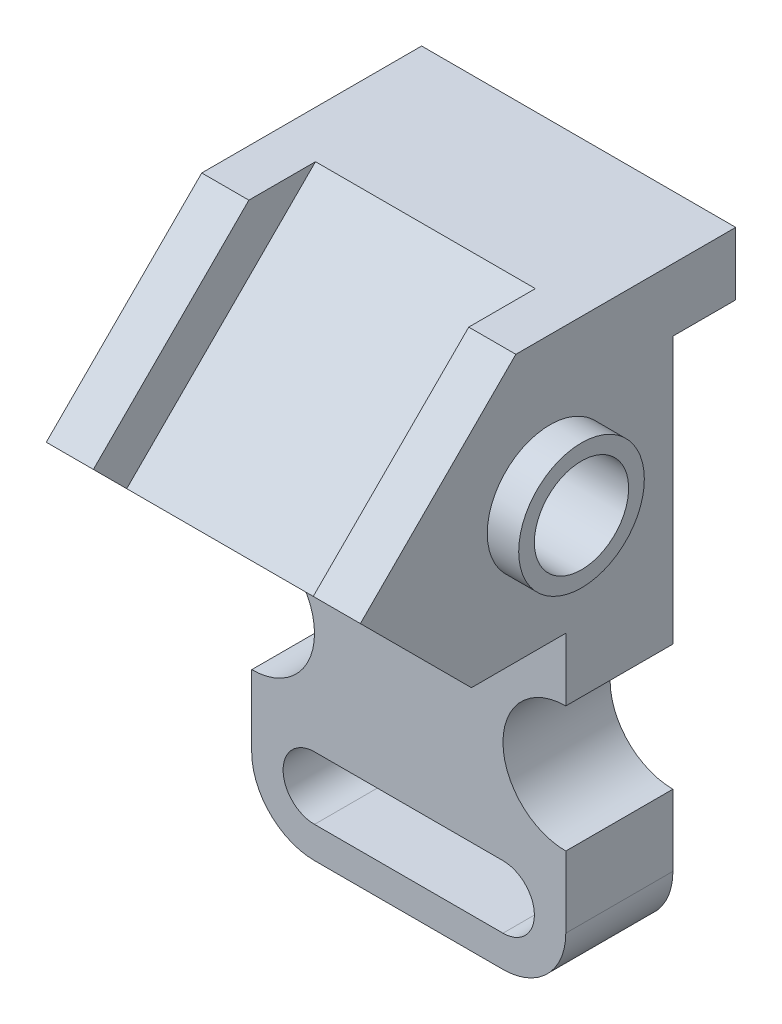
ISO-10303-21;
HEADER;
FILE_DESCRIPTION(('STEP AP214'),'2;1');
FILE_NAME('part.step','',(''),(''),'','','');
FILE_SCHEMA(('AUTOMOTIVE_DESIGN { 1 0 10303 214 1 1 1 1 }'));
ENDSEC;
DATA;
#1=APPLICATION_CONTEXT('core data for automotive mechanical design processes');
#2=APPLICATION_PROTOCOL_DEFINITION('international standard','automotive_design',2000,#1);
#3=PRODUCT_CONTEXT('',#1,'mechanical');
#4=PRODUCT('Part','Part','',(#3));
#5=PRODUCT_RELATED_PRODUCT_CATEGORY('part','',(#4));
#6=PRODUCT_DEFINITION_FORMATION('','',#4);
#7=PRODUCT_DEFINITION_CONTEXT('part definition',#1,'design');
#8=PRODUCT_DEFINITION('design','',#6,#7);
#9=PRODUCT_DEFINITION_SHAPE('','',#8);
#10=(LENGTH_UNIT() NAMED_UNIT(*) SI_UNIT(.MILLI.,.METRE.));
#11=(NAMED_UNIT(*) PLANE_ANGLE_UNIT() SI_UNIT($,.RADIAN.));
#12=(NAMED_UNIT(*) SI_UNIT($,.STERADIAN.) SOLID_ANGLE_UNIT());
#13=UNCERTAINTY_MEASURE_WITH_UNIT(LENGTH_MEASURE(1.E-05),#10,'distance_accuracy_value','');
#14=(GEOMETRIC_REPRESENTATION_CONTEXT(3) GLOBAL_UNCERTAINTY_ASSIGNED_CONTEXT((#13)) GLOBAL_UNIT_ASSIGNED_CONTEXT((#10,
#11,#12)) REPRESENTATION_CONTEXT('',''));
#15=CARTESIAN_POINT('',(0.,0.,0.));
#16=DIRECTION('',(0.,0.,1.));
#17=DIRECTION('',(1.,0.,0.));
#18=AXIS2_PLACEMENT_3D('',#15,#16,#17);
#19=CARTESIAN_POINT('',(0.,187.553608525557,34.1));
#20=DIRECTION('',(0.,-1.,0.));
#21=DIRECTION('',(0.,0.,-1.));
#22=AXIS2_PLACEMENT_3D('',#19,#20,#21);
#23=PLANE('',#22);
#24=DIRECTION('',(0.,0.,1.));
#25=VECTOR('',#24,1.);
#26=CARTESIAN_POINT('',(-35.,187.553608525557,34.1));
#27=LINE('',#26,#25);
#28=CARTESIAN_POINT('',(-35.,187.553608525557,28.7867965644037));
#29=VERTEX_POINT('',#28);
#30=CARTESIAN_POINT('',(-35.0000000000001,187.553608525557,50.));
#31=VERTEX_POINT('',#30);
#32=EDGE_CURVE('E54',#29,#31,#27,.T.);
#33=ORIENTED_EDGE('',*,*,#32,.F.);
#34=DIRECTION('',(1.,0.,0.));
#35=VECTOR('',#34,1.);
#36=CARTESIAN_POINT('',(0.,187.553608525557,28.7867965644037));
#37=LINE('',#36,#35);
#38=CARTESIAN_POINT('',(35.,187.553608525557,28.7867965644037));
#39=VERTEX_POINT('',#38);
#40=EDGE_CURVE('E271',#29,#39,#37,.T.);
#41=ORIENTED_EDGE('',*,*,#40,.T.);
#42=DIRECTION('',(0.,0.,1.));
#43=VECTOR('',#42,1.);
#44=CARTESIAN_POINT('',(35.,187.553608525557,34.1));
#45=LINE('',#44,#43);
#46=CARTESIAN_POINT('',(35.,187.553608525557,50.));
#47=VERTEX_POINT('',#46);
#48=EDGE_CURVE('E268',#39,#47,#45,.T.);
#49=ORIENTED_EDGE('',*,*,#48,.T.);
#50=DIRECTION('',(1.,0.,0.));
#51=VECTOR('',#50,1.);
#52=CARTESIAN_POINT('',(-107.129966372259,187.553608525557,50.));
#53=LINE('',#52,#51);
#54=CARTESIAN_POINT('',(50.,187.553608525557,50.));
#55=VERTEX_POINT('',#54);
#56=EDGE_CURVE('E283',#47,#55,#53,.T.);
#57=ORIENTED_EDGE('',*,*,#56,.T.);
#58=DIRECTION('',(0.,0.,-1.));
#59=VECTOR('',#58,1.);
#60=CARTESIAN_POINT('',(50.,187.553608525557,34.1));
#61=LINE('',#60,#59);
#62=CARTESIAN_POINT('',(50.,187.553608525557,-20.));
#63=VERTEX_POINT('',#62);
#64=EDGE_CURVE('E301',#55,#63,#61,.T.);
#65=ORIENTED_EDGE('',*,*,#64,.T.);
#66=DIRECTION('',(1.,0.,0.));
#67=VECTOR('',#66,1.);
#68=CARTESIAN_POINT('',(-28.2842712474619,187.553608525557,-20.));
#69=LINE('',#68,#67);
#70=CARTESIAN_POINT('',(-50.,187.553608525557,-20.));
#71=VERTEX_POINT('',#70);
#72=EDGE_CURVE('E298',#71,#63,#69,.T.);
#73=ORIENTED_EDGE('',*,*,#72,.F.);
#74=DIRECTION('',(0.,0.,-1.));
#75=VECTOR('',#74,1.);
#76=CARTESIAN_POINT('',(-50.,187.553608525557,34.1));
#77=LINE('',#76,#75);
#78=CARTESIAN_POINT('',(-50.,187.553608525557,50.));
#79=VERTEX_POINT('',#78);
#80=EDGE_CURVE('E228',#79,#71,#77,.T.);
#81=ORIENTED_EDGE('',*,*,#80,.F.);
#82=DIRECTION('',(-1.,0.,0.));
#83=VECTOR('',#82,1.);
#84=CARTESIAN_POINT('',(107.129966372259,187.553608525557,50.));
#85=LINE('',#84,#83);
#86=EDGE_CURVE('E217',#31,#79,#85,.T.);
#87=ORIENTED_EDGE('',*,*,#86,.F.);
#88=EDGE_LOOP('',(#33,#41,#49,#57,#65,#73,#81,#87));
#89=FACE_BOUND('',#88,.T.);
#90=ADVANCED_FACE('F39',(#89),#23,.F.);
#91=CARTESIAN_POINT('',(-107.129966372259,138.056133842498,99.4974746830582));
#92=DIRECTION('',(0.,-0.70710678118655,0.707106781186545));
#93=DIRECTION('',(0.,-0.707106781186545,-0.70710678118655));
#94=AXIS2_PLACEMENT_3D('',#91,#92,#93);
#95=PLANE('',#94);
#96=DIRECTION('',(1.,0.,0.));
#97=VECTOR('',#96,1.);
#98=CARTESIAN_POINT('',(35.,127.4495321247,88.8908729652599));
#99=LINE('',#98,#97);
#100=CARTESIAN_POINT('',(-35.,127.4495321247,88.8908729652599));
#101=VERTEX_POINT('',#100);
#102=CARTESIAN_POINT('',(35.,127.4495321247,88.8908729652599));
#103=VERTEX_POINT('',#102);
#104=EDGE_CURVE('E208',#101,#103,#99,.T.);
#105=ORIENTED_EDGE('',*,*,#104,.F.);
#106=DIRECTION('',(0.,0.707106781186546,0.707106781186549));
#107=VECTOR('',#106,1.);
#108=CARTESIAN_POINT('',(-35.,138.056133842498,99.4974746830582));
#109=LINE('',#108,#107);
#110=CARTESIAN_POINT('',(-35.,138.056133842498,99.4974746830582));
#111=VERTEX_POINT('',#110);
#112=EDGE_CURVE('E196',#101,#111,#109,.T.);
#113=ORIENTED_EDGE('',*,*,#112,.T.);
#114=DIRECTION('',(-1.,0.,0.));
#115=VECTOR('',#114,1.);
#116=CARTESIAN_POINT('',(107.129966372259,138.056133842498,99.4974746830582));
#117=LINE('',#116,#115);
#118=CARTESIAN_POINT('',(-50.,138.056133842498,99.4974746830582));
#119=VERTEX_POINT('',#118);
#120=EDGE_CURVE('E204',#111,#119,#117,.T.);
#121=ORIENTED_EDGE('',*,*,#120,.T.);
#122=DIRECTION('',(0.,-0.707106781186545,-0.70710678118655));
#123=VECTOR('',#122,1.);
#124=CARTESIAN_POINT('',(-50.,138.056133842498,99.4974746830582));
#125=LINE('',#124,#123);
#126=CARTESIAN_POINT('',(-50.,102.700794783171,64.1421356237307));
#127=VERTEX_POINT('',#126);
#128=EDGE_CURVE('E221',#119,#127,#125,.T.);
#129=ORIENTED_EDGE('',*,*,#128,.T.);
#130=DIRECTION('',(1.,0.,0.));
#131=VECTOR('',#130,1.);
#132=CARTESIAN_POINT('',(-107.129966372259,102.700794783171,64.1421356237307));
#133=LINE('',#132,#131);
#134=CARTESIAN_POINT('',(50.,102.700794783171,64.1421356237307));
#135=VERTEX_POINT('',#134);
#136=EDGE_CURVE('E288',#127,#135,#133,.T.);
#137=ORIENTED_EDGE('',*,*,#136,.T.);
#138=DIRECTION('',(0.,-0.707106781186545,-0.70710678118655));
#139=VECTOR('',#138,1.);
#140=CARTESIAN_POINT('',(50.,138.056133842498,99.4974746830582));
#141=LINE('',#140,#139);
#142=CARTESIAN_POINT('',(50.,138.056133842498,99.4974746830582));
#143=VERTEX_POINT('',#142);
#144=EDGE_CURVE('E277',#143,#135,#141,.T.);
#145=ORIENTED_EDGE('',*,*,#144,.F.);
#146=DIRECTION('',(1.,0.,0.));
#147=VECTOR('',#146,1.);
#148=CARTESIAN_POINT('',(-107.129966372259,138.056133842498,99.4974746830582));
#149=LINE('',#148,#147);
#150=CARTESIAN_POINT('',(35.,138.056133842498,99.4974746830582));
#151=VERTEX_POINT('',#150);
#152=EDGE_CURVE('E290',#151,#143,#149,.T.);
#153=ORIENTED_EDGE('',*,*,#152,.F.);
#154=DIRECTION('',(0.,0.707106781186546,0.707106781186549));
#155=VECTOR('',#154,1.);
#156=CARTESIAN_POINT('',(35.,138.056133842498,99.4974746830582));
#157=LINE('',#156,#155);
#158=EDGE_CURVE('E264',#103,#151,#157,.T.);
#159=ORIENTED_EDGE('',*,*,#158,.F.);
#160=EDGE_LOOP('',(#105,#113,#121,#129,#137,#145,#153,#159));
#161=FACE_BOUND('',#160,.T.);
#162=ADVANCED_FACE('F202',(#161),#95,.T.);
#163=CARTESIAN_POINT('',(107.129966372259,187.553608525557,50.));
#164=DIRECTION('',(0.,-0.707106781186546,-0.70710678118655));
#165=DIRECTION('',(0.,0.70710678118655,-0.707106781186546));
#166=AXIS2_PLACEMENT_3D('',#163,#164,#165);
#167=PLANE('',#166);
#168=DIRECTION('',(0.,-0.70710678118655,0.707106781186546));
#169=VECTOR('',#168,1.);
#170=CARTESIAN_POINT('',(-35.0000000000001,187.553608525557,50.));
#171=LINE('',#170,#169);
#172=EDGE_CURVE('E47',#31,#111,#171,.T.);
#173=ORIENTED_EDGE('',*,*,#172,.F.);
#174=ORIENTED_EDGE('',*,*,#86,.T.);
#175=DIRECTION('',(0.,-0.70710678118655,0.707106781186546));
#176=VECTOR('',#175,1.);
#177=CARTESIAN_POINT('',(-50.,187.553608525557,50.));
#178=LINE('',#177,#176);
#179=EDGE_CURVE('E215',#79,#119,#178,.T.);
#180=ORIENTED_EDGE('',*,*,#179,.T.);
#181=ORIENTED_EDGE('',*,*,#120,.F.);
#182=EDGE_LOOP('',(#173,#174,#180,#181));
#183=FACE_BOUND('',#182,.T.);
#184=ADVANCED_FACE('F213',(#183),#167,.F.);
#185=CARTESIAN_POINT('',(0.,0.,34.1));
#186=DIRECTION('',(0.,0.,1.));
#187=DIRECTION('',(1.,0.,0.));
#188=AXIS2_PLACEMENT_3D('',#185,#186,#187);
#189=PLANE('',#188);
#190=CARTESIAN_POINT('',(-30.,20.,34.1));
#191=DIRECTION('',(0.,0.,-1.));
#192=DIRECTION('',(-1.,0.,0.));
#193=AXIS2_PLACEMENT_3D('',#190,#191,#192);
#194=CIRCLE('',#193,10.);
#195=CARTESIAN_POINT('',(-30.,9.99999999999999,34.1));
#196=VERTEX_POINT('',#195);
#197=CARTESIAN_POINT('',(-30.,30.,34.1));
#198=VERTEX_POINT('',#197);
#199=EDGE_CURVE('E232',#196,#198,#194,.T.);
#200=ORIENTED_EDGE('',*,*,#199,.T.);
#201=DIRECTION('',(-1.,0.,0.));
#202=VECTOR('',#201,1.);
#203=CARTESIAN_POINT('',(5.68989300120404E-13,30.0000000000006,34.1));
#204=LINE('',#203,#202);
#205=CARTESIAN_POINT('',(30.,30.,34.1));
#206=VERTEX_POINT('',#205);
#207=EDGE_CURVE('E322',#206,#198,#204,.T.);
#208=ORIENTED_EDGE('',*,*,#207,.F.);
#209=CARTESIAN_POINT('',(30.,20.,34.1));
#210=DIRECTION('',(0.,0.,1.));
#211=DIRECTION('',(1.,0.,0.));
#212=AXIS2_PLACEMENT_3D('',#209,#210,#211);
#213=CIRCLE('',#212,10.);
#214=CARTESIAN_POINT('',(30.,9.99999999999999,34.1));
#215=VERTEX_POINT('',#214);
#216=EDGE_CURVE('E307',#215,#206,#213,.T.);
#217=ORIENTED_EDGE('',*,*,#216,.F.);
#218=DIRECTION('',(-1.,0.,0.));
#219=VECTOR('',#218,1.);
#220=CARTESIAN_POINT('',(0.,9.99999999999999,34.1));
#221=LINE('',#220,#219);
#222=EDGE_CURVE('E310',#215,#196,#221,.T.);
#223=ORIENTED_EDGE('',*,*,#222,.T.);
#224=EDGE_LOOP('',(#200,#208,#217,#223));
#225=FACE_BOUND('',#224,.T.);
#226=DIRECTION('',(1.,0.,0.));
#227=VECTOR('',#226,1.);
#228=CARTESIAN_POINT('',(-107.129966372259,102.700794783171,34.1));
#229=LINE('',#228,#227);
#230=CARTESIAN_POINT('',(-50.,102.700794783171,34.1));
#231=VERTEX_POINT('',#230);
#232=CARTESIAN_POINT('',(50.,102.700794783171,34.1));
#233=VERTEX_POINT('',#232);
#234=EDGE_CURVE('E284',#231,#233,#229,.T.);
#235=ORIENTED_EDGE('',*,*,#234,.F.);
#236=DIRECTION('',(0.,1.,0.));
#237=VECTOR('',#236,1.);
#238=CARTESIAN_POINT('',(-50.,0.,34.1));
#239=LINE('',#238,#237);
#240=CARTESIAN_POINT('',(-50.,82.6536085255568,34.1));
#241=VERTEX_POINT('',#240);
#242=EDGE_CURVE('E235',#241,#231,#239,.T.);
#243=ORIENTED_EDGE('',*,*,#242,.F.);
#244=CARTESIAN_POINT('',(-50.,62.6536085255568,34.1));
#245=DIRECTION('',(0.,0.,-1.));
#246=DIRECTION('',(-1.,0.,0.));
#247=AXIS2_PLACEMENT_3D('',#244,#245,#246);
#248=CIRCLE('',#247,20.);
#249=CARTESIAN_POINT('',(-50.,42.6536085255568,34.1));
#250=VERTEX_POINT('',#249);
#251=EDGE_CURVE('E239',#241,#250,#248,.T.);
#252=ORIENTED_EDGE('',*,*,#251,.T.);
#253=DIRECTION('',(0.,1.,0.));
#254=VECTOR('',#253,1.);
#255=CARTESIAN_POINT('',(-50.,0.,34.1));
#256=LINE('',#255,#254);
#257=CARTESIAN_POINT('',(-50.,20.,34.1));
#258=VERTEX_POINT('',#257);
#259=EDGE_CURVE('E242',#258,#250,#256,.T.);
#260=ORIENTED_EDGE('',*,*,#259,.F.);
#261=CARTESIAN_POINT('',(-30.,20.,34.1));
#262=DIRECTION('',(0.,0.,1.));
#263=DIRECTION('',(1.,0.,0.));
#264=AXIS2_PLACEMENT_3D('',#261,#262,#263);
#265=CIRCLE('',#264,20.);
#266=CARTESIAN_POINT('',(-30.,0.,34.1));
#267=VERTEX_POINT('',#266);
#268=EDGE_CURVE('E200',#258,#267,#265,.T.);
#269=ORIENTED_EDGE('',*,*,#268,.T.);
#270=DIRECTION('',(1.,0.,0.));
#271=VECTOR('',#270,1.);
#272=CARTESIAN_POINT('',(0.,0.,34.1));
#273=LINE('',#272,#271);
#274=CARTESIAN_POINT('',(30.,0.,34.1));
#275=VERTEX_POINT('',#274);
#276=EDGE_CURVE('E313',#267,#275,#273,.T.);
#277=ORIENTED_EDGE('',*,*,#276,.T.);
#278=CARTESIAN_POINT('',(30.,20.,34.1));
#279=DIRECTION('',(0.,0.,1.));
#280=DIRECTION('',(1.,0.,0.));
#281=AXIS2_PLACEMENT_3D('',#278,#279,#280);
#282=CIRCLE('',#281,20.);
#283=CARTESIAN_POINT('',(50.,20.,34.1));
#284=VERTEX_POINT('',#283);
#285=EDGE_CURVE('E357',#275,#284,#282,.T.);
#286=ORIENTED_EDGE('',*,*,#285,.T.);
#287=DIRECTION('',(0.,1.,0.));
#288=VECTOR('',#287,1.);
#289=CARTESIAN_POINT('',(50.,0.,34.1));
#290=LINE('',#289,#288);
#291=CARTESIAN_POINT('',(50.,42.6536085255568,34.1));
#292=VERTEX_POINT('',#291);
#293=EDGE_CURVE('E315',#284,#292,#290,.T.);
#294=ORIENTED_EDGE('',*,*,#293,.T.);
#295=CARTESIAN_POINT('',(50.,62.6536085255568,34.1));
#296=DIRECTION('',(0.,0.,1.));
#297=DIRECTION('',(1.,0.,0.));
#298=AXIS2_PLACEMENT_3D('',#295,#296,#297);
#299=CIRCLE('',#298,20.);
#300=CARTESIAN_POINT('',(50.,82.6536085255568,34.1));
#301=VERTEX_POINT('',#300);
#302=EDGE_CURVE('E317',#301,#292,#299,.T.);
#303=ORIENTED_EDGE('',*,*,#302,.F.);
#304=DIRECTION('',(0.,1.,0.));
#305=VECTOR('',#304,1.);
#306=CARTESIAN_POINT('',(50.,0.,34.1));
#307=LINE('',#306,#305);
#308=EDGE_CURVE('E320',#301,#233,#307,.T.);
#309=ORIENTED_EDGE('',*,*,#308,.T.);
#310=EDGE_LOOP('',(#235,#243,#252,#260,#269,#277,#286,#294,#303,#309));
#311=FACE_BOUND('',#310,.T.);
#312=ADVANCED_FACE('F372',(#225,#311),#189,.T.);
#313=CARTESIAN_POINT('',(0.,0.,0.));
#314=DIRECTION('',(0.,0.,1.));
#315=DIRECTION('',(1.,0.,0.));
#316=AXIS2_PLACEMENT_3D('',#313,#314,#315);
#317=PLANE('',#316);
#318=DIRECTION('',(-1.,0.,0.));
#319=VECTOR('',#318,1.);
#320=CARTESIAN_POINT('',(5.68989300120404E-13,30.0000000000006,0.));
#321=LINE('',#320,#319);
#322=CARTESIAN_POINT('',(30.,30.,0.));
#323=VERTEX_POINT('',#322);
#324=CARTESIAN_POINT('',(-30.,30.,0.));
#325=VERTEX_POINT('',#324);
#326=EDGE_CURVE('E311',#323,#325,#321,.T.);
#327=ORIENTED_EDGE('',*,*,#326,.T.);
#328=CARTESIAN_POINT('',(-30.,20.,0.));
#329=DIRECTION('',(0.,0.,-1.));
#330=DIRECTION('',(-1.,0.,0.));
#331=AXIS2_PLACEMENT_3D('',#328,#329,#330);
#332=CIRCLE('',#331,10.);
#333=CARTESIAN_POINT('',(-30.,9.99999999999999,0.));
#334=VERTEX_POINT('',#333);
#335=EDGE_CURVE('E231',#334,#325,#332,.T.);
#336=ORIENTED_EDGE('',*,*,#335,.F.);
#337=DIRECTION('',(-1.,0.,0.));
#338=VECTOR('',#337,1.);
#339=CARTESIAN_POINT('',(0.,9.99999999999999,0.));
#340=LINE('',#339,#338);
#341=CARTESIAN_POINT('',(30.,9.99999999999999,0.));
#342=VERTEX_POINT('',#341);
#343=EDGE_CURVE('E327',#342,#334,#340,.T.);
#344=ORIENTED_EDGE('',*,*,#343,.F.);
#345=CARTESIAN_POINT('',(30.,20.,0.));
#346=DIRECTION('',(0.,0.,1.));
#347=DIRECTION('',(1.,0.,0.));
#348=AXIS2_PLACEMENT_3D('',#345,#346,#347);
#349=CIRCLE('',#348,10.);
#350=EDGE_CURVE('E306',#342,#323,#349,.T.);
#351=ORIENTED_EDGE('',*,*,#350,.T.);
#352=EDGE_LOOP('',(#327,#336,#344,#351));
#353=FACE_BOUND('',#352,.T.);
#354=DIRECTION('',(0.,1.,0.));
#355=VECTOR('',#354,1.);
#356=CARTESIAN_POINT('',(-50.,0.,0.));
#357=LINE('',#356,#355);
#358=CARTESIAN_POINT('',(-50.,82.6536085255568,0.));
#359=VERTEX_POINT('',#358);
#360=CARTESIAN_POINT('',(-50.,167.553608525557,0.));
#361=VERTEX_POINT('',#360);
#362=EDGE_CURVE('E247',#359,#361,#357,.T.);
#363=ORIENTED_EDGE('',*,*,#362,.T.);
#364=DIRECTION('',(1.,0.,0.));
#365=VECTOR('',#364,1.);
#366=CARTESIAN_POINT('',(-28.2842712474619,167.553608525557,0.));
#367=LINE('',#366,#365);
#368=CARTESIAN_POINT('',(50.,167.553608525557,0.));
#369=VERTEX_POINT('',#368);
#370=EDGE_CURVE('E62',#361,#369,#367,.T.);
#371=ORIENTED_EDGE('',*,*,#370,.T.);
#372=DIRECTION('',(0.,1.,0.));
#373=VECTOR('',#372,1.);
#374=CARTESIAN_POINT('',(50.,0.,0.));
#375=LINE('',#374,#373);
#376=CARTESIAN_POINT('',(50.,82.6536085255568,0.));
#377=VERTEX_POINT('',#376);
#378=EDGE_CURVE('E336',#377,#369,#375,.T.);
#379=ORIENTED_EDGE('',*,*,#378,.F.);
#380=CARTESIAN_POINT('',(50.,62.6536085255568,0.));
#381=DIRECTION('',(0.,0.,1.));
#382=DIRECTION('',(1.,0.,0.));
#383=AXIS2_PLACEMENT_3D('',#380,#381,#382);
#384=CIRCLE('',#383,20.);
#385=CARTESIAN_POINT('',(50.,42.6536085255568,0.));
#386=VERTEX_POINT('',#385);
#387=EDGE_CURVE('E333',#377,#386,#384,.T.);
#388=ORIENTED_EDGE('',*,*,#387,.T.);
#389=DIRECTION('',(0.,1.,0.));
#390=VECTOR('',#389,1.);
#391=CARTESIAN_POINT('',(50.,0.,0.));
#392=LINE('',#391,#390);
#393=CARTESIAN_POINT('',(50.,20.,0.));
#394=VERTEX_POINT('',#393);
#395=EDGE_CURVE('E331',#394,#386,#392,.T.);
#396=ORIENTED_EDGE('',*,*,#395,.F.);
#397=CARTESIAN_POINT('',(30.,20.,0.));
#398=DIRECTION('',(0.,0.,1.));
#399=DIRECTION('',(1.,0.,0.));
#400=AXIS2_PLACEMENT_3D('',#397,#398,#399);
#401=CIRCLE('',#400,20.);
#402=CARTESIAN_POINT('',(30.,0.,0.));
#403=VERTEX_POINT('',#402);
#404=EDGE_CURVE('E351',#394,#403,#401,.F.);
#405=ORIENTED_EDGE('',*,*,#404,.T.);
#406=DIRECTION('',(1.,0.,0.));
#407=VECTOR('',#406,1.);
#408=CARTESIAN_POINT('',(0.,0.,0.));
#409=LINE('',#408,#407);
#410=CARTESIAN_POINT('',(-30.,0.,0.));
#411=VERTEX_POINT('',#410);
#412=EDGE_CURVE('E329',#411,#403,#409,.T.);
#413=ORIENTED_EDGE('',*,*,#412,.F.);
#414=CARTESIAN_POINT('',(-30.,20.,0.));
#415=DIRECTION('',(0.,0.,1.));
#416=DIRECTION('',(1.,0.,0.));
#417=AXIS2_PLACEMENT_3D('',#414,#415,#416);
#418=CIRCLE('',#417,20.);
#419=CARTESIAN_POINT('',(-50.,20.,0.));
#420=VERTEX_POINT('',#419);
#421=EDGE_CURVE('E364',#411,#420,#418,.F.);
#422=ORIENTED_EDGE('',*,*,#421,.T.);
#423=DIRECTION('',(0.,1.,0.));
#424=VECTOR('',#423,1.);
#425=CARTESIAN_POINT('',(-50.,0.,0.));
#426=LINE('',#425,#424);
#427=CARTESIAN_POINT('',(-50.,42.6536085255568,0.));
#428=VERTEX_POINT('',#427);
#429=EDGE_CURVE('E236',#420,#428,#426,.T.);
#430=ORIENTED_EDGE('',*,*,#429,.T.);
#431=CARTESIAN_POINT('',(-50.,62.6536085255568,0.));
#432=DIRECTION('',(0.,0.,-1.));
#433=DIRECTION('',(-1.,0.,0.));
#434=AXIS2_PLACEMENT_3D('',#431,#432,#433);
#435=CIRCLE('',#434,20.);
#436=EDGE_CURVE('E249',#359,#428,#435,.T.);
#437=ORIENTED_EDGE('',*,*,#436,.F.);
#438=EDGE_LOOP('',(#363,#371,#379,#388,#396,#405,#413,#422,#430,#437));
#439=FACE_BOUND('',#438,.T.);
#440=ADVANCED_FACE('F383',(#353,#439),#317,.F.);
#441=CARTESIAN_POINT('',(30.,20.,34.1));
#442=DIRECTION('',(0.,0.,-1.));
#443=DIRECTION('',(-1.,0.,0.));
#444=AXIS2_PLACEMENT_3D('',#441,#442,#443);
#445=CYLINDRICAL_SURFACE('',#444,10.);
#446=ORIENTED_EDGE('',*,*,#350,.F.);
#447=DIRECTION('',(0.,0.,-1.));
#448=VECTOR('',#447,1.);
#449=CARTESIAN_POINT('',(30.,9.99999999999999,34.1));
#450=LINE('',#449,#448);
#451=EDGE_CURVE('E346',#215,#342,#450,.T.);
#452=ORIENTED_EDGE('',*,*,#451,.F.);
#453=ORIENTED_EDGE('',*,*,#216,.T.);
#454=DIRECTION('',(0.,0.,-1.));
#455=VECTOR('',#454,1.);
#456=CARTESIAN_POINT('',(30.,30.,34.1));
#457=LINE('',#456,#455);
#458=EDGE_CURVE('E324',#206,#323,#457,.T.);
#459=ORIENTED_EDGE('',*,*,#458,.T.);
#460=EDGE_LOOP('',(#446,#452,#453,#459));
#461=FACE_BOUND('',#460,.T.);
#462=ADVANCED_FACE('F476',(#461),#445,.F.);
#463=CARTESIAN_POINT('',(0.,9.99999999999999,34.1));
#464=DIRECTION('',(0.,-1.,0.));
#465=DIRECTION('',(1.,0.,0.));
#466=AXIS2_PLACEMENT_3D('',#463,#464,#465);
#467=PLANE('',#466);
#468=ORIENTED_EDGE('',*,*,#343,.T.);
#469=DIRECTION('',(0.,0.,-1.));
#470=VECTOR('',#469,1.);
#471=CARTESIAN_POINT('',(-30.,9.99999999999999,34.1));
#472=LINE('',#471,#470);
#473=EDGE_CURVE('E244',#196,#334,#472,.T.);
#474=ORIENTED_EDGE('',*,*,#473,.F.);
#475=ORIENTED_EDGE('',*,*,#222,.F.);
#476=ORIENTED_EDGE('',*,*,#451,.T.);
#477=EDGE_LOOP('',(#468,#474,#475,#476));
#478=FACE_BOUND('',#477,.T.);
#479=ADVANCED_FACE('F491',(#478),#467,.F.);
#480=CARTESIAN_POINT('',(0.,0.,34.1));
#481=DIRECTION('',(0.,1.,0.));
#482=DIRECTION('',(0.,0.,1.));
#483=AXIS2_PLACEMENT_3D('',#480,#481,#482);
#484=PLANE('',#483);
#485=ORIENTED_EDGE('',*,*,#276,.F.);
#486=DIRECTION('',(0.,0.,-1.));
#487=VECTOR('',#486,1.);
#488=CARTESIAN_POINT('',(-30.,0.,0.));
#489=LINE('',#488,#487);
#490=EDGE_CURVE('E361',#267,#411,#489,.T.);
#491=ORIENTED_EDGE('',*,*,#490,.T.);
#492=ORIENTED_EDGE('',*,*,#412,.T.);
#493=DIRECTION('',(0.,0.,-1.));
#494=VECTOR('',#493,1.);
#495=CARTESIAN_POINT('',(30.,0.,34.1));
#496=LINE('',#495,#494);
#497=EDGE_CURVE('E354',#403,#275,#496,.F.);
#498=ORIENTED_EDGE('',*,*,#497,.T.);
#499=EDGE_LOOP('',(#485,#491,#492,#498));
#500=FACE_BOUND('',#499,.T.);
#501=ADVANCED_FACE('F377',(#500),#484,.F.);
#502=CARTESIAN_POINT('',(50.,0.,34.1));
#503=DIRECTION('',(-1.,0.,0.));
#504=DIRECTION('',(0.,0.,1.));
#505=AXIS2_PLACEMENT_3D('',#502,#503,#504);
#506=PLANE('',#505);
#507=ORIENTED_EDGE('',*,*,#293,.F.);
#508=DIRECTION('',(0.,0.,-1.));
#509=VECTOR('',#508,1.);
#510=CARTESIAN_POINT('',(50.,20.,34.1));
#511=LINE('',#510,#509);
#512=EDGE_CURVE('E348',#284,#394,#511,.T.);
#513=ORIENTED_EDGE('',*,*,#512,.T.);
#514=ORIENTED_EDGE('',*,*,#395,.T.);
#515=DIRECTION('',(0.,0.,-1.));
#516=VECTOR('',#515,1.);
#517=CARTESIAN_POINT('',(50.,42.6536085255568,34.1));
#518=LINE('',#517,#516);
#519=EDGE_CURVE('E343',#292,#386,#518,.T.);
#520=ORIENTED_EDGE('',*,*,#519,.F.);
#521=EDGE_LOOP('',(#507,#513,#514,#520));
#522=FACE_BOUND('',#521,.T.);
#523=ADVANCED_FACE('F413',(#522),#506,.F.);
#524=CARTESIAN_POINT('',(50.,62.6536085255568,34.1));
#525=DIRECTION('',(0.,0.,-1.));
#526=DIRECTION('',(-1.,0.,0.));
#527=AXIS2_PLACEMENT_3D('',#524,#525,#526);
#528=CYLINDRICAL_SURFACE('',#527,20.);
#529=ORIENTED_EDGE('',*,*,#387,.F.);
#530=DIRECTION('',(0.,0.,-1.));
#531=VECTOR('',#530,1.);
#532=CARTESIAN_POINT('',(50.,82.6536085255568,34.1));
#533=LINE('',#532,#531);
#534=EDGE_CURVE('E341',#301,#377,#533,.T.);
#535=ORIENTED_EDGE('',*,*,#534,.F.);
#536=ORIENTED_EDGE('',*,*,#302,.T.);
#537=ORIENTED_EDGE('',*,*,#519,.T.);
#538=EDGE_LOOP('',(#529,#535,#536,#537));
#539=FACE_BOUND('',#538,.T.);
#540=ADVANCED_FACE('F408',(#539),#528,.F.);
#541=CARTESIAN_POINT('',(50.,0.,34.1));
#542=DIRECTION('',(-1.,0.,0.));
#543=DIRECTION('',(0.,0.,1.));
#544=AXIS2_PLACEMENT_3D('',#541,#542,#543);
#545=PLANE('',#544);
#546=CARTESIAN_POINT('',(50.,142.700794783171,39.1));
#547=DIRECTION('',(-1.,0.,0.));
#548=DIRECTION('',(0.,0.,1.));
#549=AXIS2_PLACEMENT_3D('',#546,#547,#548);
#550=CIRCLE('',#549,20.);
#551=CARTESIAN_POINT('',(50.,142.700794783171,59.1));
#552=VERTEX_POINT('',#551);
#553=EDGE_CURVE('E11',#552,#552,#550,.F.);
#554=ORIENTED_EDGE('',*,*,#553,.F.);
#555=EDGE_LOOP('',(#554));
#556=FACE_BOUND('',#555,.T.);
#557=ORIENTED_EDGE('',*,*,#378,.T.);
#558=DIRECTION('',(0.,0.,-1.));
#559=VECTOR('',#558,1.);
#560=CARTESIAN_POINT('',(50.,167.553608525557,-20.));
#561=LINE('',#560,#559);
#562=CARTESIAN_POINT('',(50.,167.553608525557,-20.));
#563=VERTEX_POINT('',#562);
#564=EDGE_CURVE('E287',#369,#563,#561,.T.);
#565=ORIENTED_EDGE('',*,*,#564,.T.);
#566=DIRECTION('',(0.,1.,0.));
#567=VECTOR('',#566,1.);
#568=CARTESIAN_POINT('',(50.,187.553608525557,-20.));
#569=LINE('',#568,#567);
#570=EDGE_CURVE('E295',#563,#63,#569,.T.);
#571=ORIENTED_EDGE('',*,*,#570,.T.);
#572=ORIENTED_EDGE('',*,*,#64,.F.);
#573=DIRECTION('',(0.,-0.70710678118655,0.707106781186546));
#574=VECTOR('',#573,1.);
#575=CARTESIAN_POINT('',(50.,187.553608525557,50.));
#576=LINE('',#575,#574);
#577=EDGE_CURVE('E274',#55,#143,#576,.T.);
#578=ORIENTED_EDGE('',*,*,#577,.T.);
#579=ORIENTED_EDGE('',*,*,#144,.T.);
#580=DIRECTION('',(0.,0.,-1.));
#581=VECTOR('',#580,1.);
#582=CARTESIAN_POINT('',(50.,102.700794783171,64.1421356237307));
#583=LINE('',#582,#581);
#584=EDGE_CURVE('E280',#135,#233,#583,.T.);
#585=ORIENTED_EDGE('',*,*,#584,.T.);
#586=ORIENTED_EDGE('',*,*,#308,.F.);
#587=ORIENTED_EDGE('',*,*,#534,.T.);
#588=EDGE_LOOP('',(#557,#565,#571,#572,#578,#579,#585,#586,#587));
#589=FACE_BOUND('',#588,.T.);
#590=ADVANCED_FACE('F402',(#556,#589),#545,.F.);
#591=CARTESIAN_POINT('',(5.68989300120404E-13,30.0000000000006,34.1));
#592=DIRECTION('',(0.,-1.,0.));
#593=DIRECTION('',(1.,0.,0.));
#594=AXIS2_PLACEMENT_3D('',#591,#592,#593);
#595=PLANE('',#594);
#596=ORIENTED_EDGE('',*,*,#326,.F.);
#597=ORIENTED_EDGE('',*,*,#458,.F.);
#598=ORIENTED_EDGE('',*,*,#207,.T.);
#599=DIRECTION('',(0.,0.,-1.));
#600=VECTOR('',#599,1.);
#601=CARTESIAN_POINT('',(-30.,30.,34.1));
#602=LINE('',#601,#600);
#603=EDGE_CURVE('E260',#198,#325,#602,.T.);
#604=ORIENTED_EDGE('',*,*,#603,.T.);
#605=EDGE_LOOP('',(#596,#597,#598,#604));
#606=FACE_BOUND('',#605,.T.);
#607=ADVANCED_FACE('F478',(#606),#595,.T.);
#608=CARTESIAN_POINT('',(30.,20.,34.1));
#609=DIRECTION('',(0.,0.,-1.));
#610=DIRECTION('',(-1.,0.,0.));
#611=AXIS2_PLACEMENT_3D('',#608,#609,#610);
#612=CYLINDRICAL_SURFACE('',#611,20.);
#613=ORIENTED_EDGE('',*,*,#285,.F.);
#614=ORIENTED_EDGE('',*,*,#497,.F.);
#615=ORIENTED_EDGE('',*,*,#404,.F.);
#616=ORIENTED_EDGE('',*,*,#512,.F.);
#617=EDGE_LOOP('',(#613,#614,#615,#616));
#618=FACE_BOUND('',#617,.T.);
#619=ADVANCED_FACE('F416',(#618),#612,.T.);
#620=CARTESIAN_POINT('',(-28.2842712474619,187.553608525557,-20.));
#621=DIRECTION('',(0.,0.,-1.));
#622=DIRECTION('',(0.,1.,0.));
#623=AXIS2_PLACEMENT_3D('',#620,#621,#622);
#624=PLANE('',#623);
#625=DIRECTION('',(1.,0.,0.));
#626=VECTOR('',#625,1.);
#627=CARTESIAN_POINT('',(-28.2842712474619,167.553608525557,-20.));
#628=LINE('',#627,#626);
#629=CARTESIAN_POINT('',(-50.,167.553608525557,-20.));
#630=VERTEX_POINT('',#629);
#631=EDGE_CURVE('E302',#630,#563,#628,.T.);
#632=ORIENTED_EDGE('',*,*,#631,.F.);
#633=DIRECTION('',(0.,1.,0.));
#634=VECTOR('',#633,1.);
#635=CARTESIAN_POINT('',(-50.,187.553608525557,-20.));
#636=LINE('',#635,#634);
#637=EDGE_CURVE('E219',#630,#71,#636,.T.);
#638=ORIENTED_EDGE('',*,*,#637,.T.);
#639=ORIENTED_EDGE('',*,*,#72,.T.);
#640=ORIENTED_EDGE('',*,*,#570,.F.);
#641=EDGE_LOOP('',(#632,#638,#639,#640));
#642=FACE_BOUND('',#641,.T.);
#643=ADVANCED_FACE('F399',(#642),#624,.T.);
#644=CARTESIAN_POINT('',(-28.2842712474619,167.553608525557,-20.));
#645=DIRECTION('',(0.,-1.,0.));
#646=DIRECTION('',(0.,0.,-1.));
#647=AXIS2_PLACEMENT_3D('',#644,#645,#646);
#648=PLANE('',#647);
#649=ORIENTED_EDGE('',*,*,#370,.F.);
#650=DIRECTION('',(0.,0.,-1.));
#651=VECTOR('',#650,1.);
#652=CARTESIAN_POINT('',(-50.,167.553608525557,-20.));
#653=LINE('',#652,#651);
#654=EDGE_CURVE('E226',#361,#630,#653,.T.);
#655=ORIENTED_EDGE('',*,*,#654,.T.);
#656=ORIENTED_EDGE('',*,*,#631,.T.);
#657=ORIENTED_EDGE('',*,*,#564,.F.);
#658=EDGE_LOOP('',(#649,#655,#656,#657));
#659=FACE_BOUND('',#658,.T.);
#660=ADVANCED_FACE('F396',(#659),#648,.T.);
#661=CARTESIAN_POINT('',(-107.129966372259,102.700794783171,64.1421356237307));
#662=DIRECTION('',(0.,-1.,0.));
#663=DIRECTION('',(0.,0.,-1.));
#664=AXIS2_PLACEMENT_3D('',#661,#662,#663);
#665=PLANE('',#664);
#666=ORIENTED_EDGE('',*,*,#136,.F.);
#667=DIRECTION('',(0.,0.,-1.));
#668=VECTOR('',#667,1.);
#669=CARTESIAN_POINT('',(-50.,102.700794783171,64.1421356237307));
#670=LINE('',#669,#668);
#671=EDGE_CURVE('E423',#127,#231,#670,.T.);
#672=ORIENTED_EDGE('',*,*,#671,.T.);
#673=ORIENTED_EDGE('',*,*,#234,.T.);
#674=ORIENTED_EDGE('',*,*,#584,.F.);
#675=EDGE_LOOP('',(#666,#672,#673,#674));
#676=FACE_BOUND('',#675,.T.);
#677=ADVANCED_FACE('F421',(#676),#665,.T.);
#678=CARTESIAN_POINT('',(-107.129966372259,187.553608525557,50.));
#679=DIRECTION('',(0.,0.707106781186546,0.707106781186549));
#680=DIRECTION('',(0.,-0.707106781186549,0.707106781186546));
#681=AXIS2_PLACEMENT_3D('',#678,#679,#680);
#682=PLANE('',#681);
#683=DIRECTION('',(0.,0.707106781186549,-0.707106781186546));
#684=VECTOR('',#683,1.);
#685=CARTESIAN_POINT('',(35.,187.553608525557,50.));
#686=LINE('',#685,#684);
#687=EDGE_CURVE('E359',#151,#47,#686,.T.);
#688=ORIENTED_EDGE('',*,*,#687,.F.);
#689=ORIENTED_EDGE('',*,*,#152,.T.);
#690=ORIENTED_EDGE('',*,*,#577,.F.);
#691=ORIENTED_EDGE('',*,*,#56,.F.);
#692=EDGE_LOOP('',(#688,#689,#690,#691));
#693=FACE_BOUND('',#692,.T.);
#694=ADVANCED_FACE('F447',(#693),#682,.T.);
#695=CARTESIAN_POINT('',(0.,142.700794783171,39.1));
#696=DIRECTION('',(1.,0.,0.));
#697=DIRECTION('',(0.,0.,-1.));
#698=AXIS2_PLACEMENT_3D('',#695,#696,#697);
#699=CYLINDRICAL_SURFACE('',#698,15.);
#700=CARTESIAN_POINT('',(-50.,142.700794783171,39.1));
#701=DIRECTION('',(-1.,0.,0.));
#702=DIRECTION('',(0.,-1.,0.));
#703=AXIS2_PLACEMENT_3D('',#700,#701,#702);
#704=CIRCLE('',#703,15.);
#705=CARTESIAN_POINT('',(-50.,127.700794783171,39.1));
#706=VERTEX_POINT('',#705);
#707=EDGE_CURVE('E428',#706,#706,#704,.F.);
#708=ORIENTED_EDGE('',*,*,#707,.F.);
#709=EDGE_LOOP('',(#708));
#710=FACE_BOUND('',#709,.T.);
#711=CARTESIAN_POINT('',(60.,142.700794783171,39.1));
#712=DIRECTION('',(-1.,0.,0.));
#713=DIRECTION('',(0.,0.,1.));
#714=AXIS2_PLACEMENT_3D('',#711,#712,#713);
#715=CIRCLE('',#714,15.);
#716=CARTESIAN_POINT('',(60.,142.700794783171,54.1));
#717=VERTEX_POINT('',#716);
#718=EDGE_CURVE('E437',#717,#717,#715,.T.);
#719=ORIENTED_EDGE('',*,*,#718,.F.);
#720=EDGE_LOOP('',(#719));
#721=FACE_BOUND('',#720,.T.);
#722=ADVANCED_FACE('F444',(#710,#721),#699,.F.);
#723=CARTESIAN_POINT('',(35.,211.947006807759,4.39339828220198));
#724=DIRECTION('',(0.,-0.707106781186545,-0.70710678118655));
#725=DIRECTION('',(0.,0.70710678118655,-0.707106781186545));
#726=AXIS2_PLACEMENT_3D('',#723,#724,#725);
#727=PLANE('',#726);
#728=ORIENTED_EDGE('',*,*,#40,.F.);
#729=DIRECTION('',(0.,-0.70710678118655,0.707106781186545));
#730=VECTOR('',#729,1.);
#731=CARTESIAN_POINT('',(-35.0000000000001,211.947006807759,4.39339828220195));
#732=LINE('',#731,#730);
#733=EDGE_CURVE('E210',#29,#101,#732,.T.);
#734=ORIENTED_EDGE('',*,*,#733,.T.);
#735=ORIENTED_EDGE('',*,*,#104,.T.);
#736=DIRECTION('',(0.,-0.70710678118655,0.707106781186545));
#737=VECTOR('',#736,1.);
#738=CARTESIAN_POINT('',(35.,211.947006807759,4.39339828220198));
#739=LINE('',#738,#737);
#740=EDGE_CURVE('E266',#39,#103,#739,.T.);
#741=ORIENTED_EDGE('',*,*,#740,.F.);
#742=EDGE_LOOP('',(#728,#734,#735,#741));
#743=FACE_BOUND('',#742,.T.);
#744=ADVANCED_FACE('F446',(#743),#727,.F.);
#745=CARTESIAN_POINT('',(35.,222.553608525557,15.0000000000002));
#746=DIRECTION('',(1.,0.,0.));
#747=DIRECTION('',(0.,0.,-1.));
#748=AXIS2_PLACEMENT_3D('',#745,#746,#747);
#749=PLANE('',#748);
#750=ORIENTED_EDGE('',*,*,#740,.T.);
#751=ORIENTED_EDGE('',*,*,#158,.T.);
#752=ORIENTED_EDGE('',*,*,#687,.T.);
#753=ORIENTED_EDGE('',*,*,#48,.F.);
#754=EDGE_LOOP('',(#750,#751,#752,#753));
#755=FACE_BOUND('',#754,.T.);
#756=ADVANCED_FACE('F454',(#755),#749,.F.);
#757=CARTESIAN_POINT('',(-30.,20.,34.1));
#758=DIRECTION('',(0.,0.,-1.));
#759=DIRECTION('',(-1.,0.,0.));
#760=AXIS2_PLACEMENT_3D('',#757,#758,#759);
#761=CYLINDRICAL_SURFACE('',#760,10.);
#762=ORIENTED_EDGE('',*,*,#335,.T.);
#763=ORIENTED_EDGE('',*,*,#603,.F.);
#764=ORIENTED_EDGE('',*,*,#199,.F.);
#765=ORIENTED_EDGE('',*,*,#473,.T.);
#766=EDGE_LOOP('',(#762,#763,#764,#765));
#767=FACE_BOUND('',#766,.T.);
#768=ADVANCED_FACE('F527',(#767),#761,.F.);
#769=CARTESIAN_POINT('',(-50.,0.,34.1));
#770=DIRECTION('',(-1.,0.,0.));
#771=DIRECTION('',(0.,-1.,0.));
#772=AXIS2_PLACEMENT_3D('',#769,#770,#771);
#773=PLANE('',#772);
#774=ORIENTED_EDGE('',*,*,#707,.T.);
#775=EDGE_LOOP('',(#774));
#776=FACE_BOUND('',#775,.T.);
#777=ORIENTED_EDGE('',*,*,#362,.F.);
#778=DIRECTION('',(0.,0.,-1.));
#779=VECTOR('',#778,1.);
#780=CARTESIAN_POINT('',(-50.,82.6536085255568,34.1));
#781=LINE('',#780,#779);
#782=EDGE_CURVE('E258',#241,#359,#781,.T.);
#783=ORIENTED_EDGE('',*,*,#782,.F.);
#784=ORIENTED_EDGE('',*,*,#242,.T.);
#785=ORIENTED_EDGE('',*,*,#671,.F.);
#786=ORIENTED_EDGE('',*,*,#128,.F.);
#787=ORIENTED_EDGE('',*,*,#179,.F.);
#788=ORIENTED_EDGE('',*,*,#80,.T.);
#789=ORIENTED_EDGE('',*,*,#637,.F.);
#790=ORIENTED_EDGE('',*,*,#654,.F.);
#791=EDGE_LOOP('',(#777,#783,#784,#785,#786,#787,#788,#789,#790));
#792=FACE_BOUND('',#791,.T.);
#793=ADVANCED_FACE('F394',(#776,#792),#773,.T.);
#794=CARTESIAN_POINT('',(-50.,62.6536085255568,34.1));
#795=DIRECTION('',(0.,0.,-1.));
#796=DIRECTION('',(-1.,0.,0.));
#797=AXIS2_PLACEMENT_3D('',#794,#795,#796);
#798=CYLINDRICAL_SURFACE('',#797,20.);
#799=ORIENTED_EDGE('',*,*,#436,.T.);
#800=DIRECTION('',(0.,0.,-1.));
#801=VECTOR('',#800,1.);
#802=CARTESIAN_POINT('',(-50.,42.6536085255568,34.1));
#803=LINE('',#802,#801);
#804=EDGE_CURVE('E255',#250,#428,#803,.T.);
#805=ORIENTED_EDGE('',*,*,#804,.F.);
#806=ORIENTED_EDGE('',*,*,#251,.F.);
#807=ORIENTED_EDGE('',*,*,#782,.T.);
#808=EDGE_LOOP('',(#799,#805,#806,#807));
#809=FACE_BOUND('',#808,.T.);
#810=ADVANCED_FACE('F390',(#809),#798,.F.);
#811=CARTESIAN_POINT('',(-50.,0.,34.1));
#812=DIRECTION('',(-1.,0.,0.));
#813=DIRECTION('',(0.,-1.,0.));
#814=AXIS2_PLACEMENT_3D('',#811,#812,#813);
#815=PLANE('',#814);
#816=ORIENTED_EDGE('',*,*,#429,.F.);
#817=DIRECTION('',(0.,0.,-1.));
#818=VECTOR('',#817,1.);
#819=CARTESIAN_POINT('',(-50.,20.,34.1));
#820=LINE('',#819,#818);
#821=EDGE_CURVE('E366',#420,#258,#820,.F.);
#822=ORIENTED_EDGE('',*,*,#821,.T.);
#823=ORIENTED_EDGE('',*,*,#259,.T.);
#824=ORIENTED_EDGE('',*,*,#804,.T.);
#825=EDGE_LOOP('',(#816,#822,#823,#824));
#826=FACE_BOUND('',#825,.T.);
#827=ADVANCED_FACE('F386',(#826),#815,.T.);
#828=CARTESIAN_POINT('',(-30.,20.,34.1));
#829=DIRECTION('',(0.,0.,1.));
#830=DIRECTION('',(1.,0.,0.));
#831=AXIS2_PLACEMENT_3D('',#828,#829,#830);
#832=CYLINDRICAL_SURFACE('',#831,20.);
#833=ORIENTED_EDGE('',*,*,#268,.F.);
#834=ORIENTED_EDGE('',*,*,#821,.F.);
#835=ORIENTED_EDGE('',*,*,#421,.F.);
#836=ORIENTED_EDGE('',*,*,#490,.F.);
#837=EDGE_LOOP('',(#833,#834,#835,#836));
#838=FACE_BOUND('',#837,.T.);
#839=ADVANCED_FACE('F41',(#838),#832,.T.);
#840=CARTESIAN_POINT('',(-35.0000000000001,222.553608525557,15.0000000000002));
#841=DIRECTION('',(1.,0.,0.));
#842=DIRECTION('',(0.,1.,0.));
#843=AXIS2_PLACEMENT_3D('',#840,#841,#842);
#844=PLANE('',#843);
#845=ORIENTED_EDGE('',*,*,#32,.T.);
#846=ORIENTED_EDGE('',*,*,#172,.T.);
#847=ORIENTED_EDGE('',*,*,#112,.F.);
#848=ORIENTED_EDGE('',*,*,#733,.F.);
#849=EDGE_LOOP('',(#845,#846,#847,#848));
#850=FACE_BOUND('',#849,.T.);
#851=ADVANCED_FACE('F195',(#850),#844,.T.);
#852=CARTESIAN_POINT('',(60.,142.700794783171,39.1));
#853=DIRECTION('',(-1.,0.,0.));
#854=DIRECTION('',(0.,0.,1.));
#855=AXIS2_PLACEMENT_3D('',#852,#853,#854);
#856=CYLINDRICAL_SURFACE('',#855,20.);
#857=CARTESIAN_POINT('',(60.,142.700794783171,39.1));
#858=DIRECTION('',(1.,0.,0.));
#859=DIRECTION('',(0.,0.,-1.));
#860=AXIS2_PLACEMENT_3D('',#857,#858,#859);
#861=CIRCLE('',#860,20.);
#862=CARTESIAN_POINT('',(60.,142.700794783171,19.1));
#863=VERTEX_POINT('',#862);
#864=EDGE_CURVE('E211',#863,#863,#861,.T.);
#865=ORIENTED_EDGE('',*,*,#864,.F.);
#866=EDGE_LOOP('',(#865));
#867=FACE_BOUND('',#866,.T.);
#868=ORIENTED_EDGE('',*,*,#553,.T.);
#869=EDGE_LOOP('',(#868));
#870=FACE_BOUND('',#869,.T.);
#871=ADVANCED_FACE('F651',(#867,#870),#856,.T.);
#872=CARTESIAN_POINT('',(60.,142.700794783171,39.1));
#873=DIRECTION('',(1.,0.,0.));
#874=DIRECTION('',(0.,0.,-1.));
#875=AXIS2_PLACEMENT_3D('',#872,#873,#874);
#876=PLANE('',#875);
#877=ORIENTED_EDGE('',*,*,#718,.T.);
#878=EDGE_LOOP('',(#877));
#879=FACE_BOUND('',#878,.T.);
#880=ORIENTED_EDGE('',*,*,#864,.T.);
#881=EDGE_LOOP('',(#880));
#882=FACE_BOUND('',#881,.T.);
#883=ADVANCED_FACE('F441',(#879,#882),#876,.T.);
#884=CLOSED_SHELL('',(#90,#162,#184,#312,#440,#462,#479,#501,#523,#540,#590,#607,#619,#643,#660,
#677,#694,#722,#744,#756,#768,#793,#810,#827,#839,#851,#871,#883));
#885=MANIFOLD_SOLID_BREP('B2',#884);
#886=ADVANCED_BREP_SHAPE_REPRESENTATION('',(#18,#885),#14);
#887=SHAPE_DEFINITION_REPRESENTATION(#9,#886);
ENDSEC;
END-ISO-10303-21;
